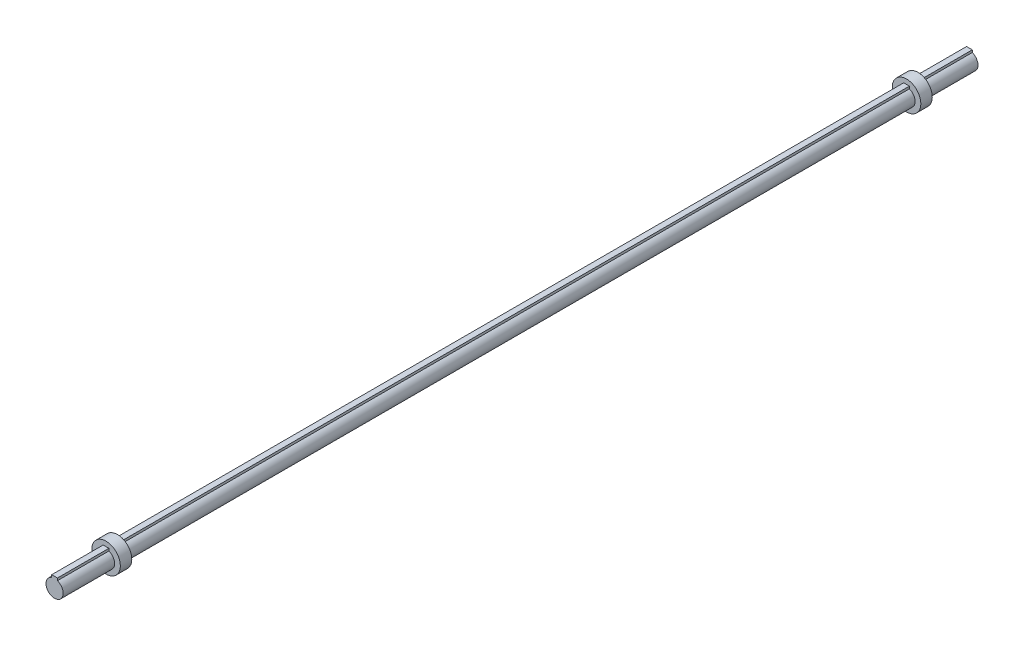
ISO-10303-21;
HEADER;
FILE_DESCRIPTION(('STEP AP214'),'2;1');
FILE_NAME('part.step','',(''),(''),'','','');
FILE_SCHEMA(('AUTOMOTIVE_DESIGN { 1 0 10303 214 1 1 1 1 }'));
ENDSEC;
DATA;
#1=APPLICATION_CONTEXT('core data for automotive mechanical design processes');
#2=APPLICATION_PROTOCOL_DEFINITION('international standard','automotive_design',2000,#1);
#3=PRODUCT_CONTEXT('',#1,'mechanical');
#4=PRODUCT('Part','Part','',(#3));
#5=PRODUCT_RELATED_PRODUCT_CATEGORY('part','',(#4));
#6=PRODUCT_DEFINITION_FORMATION('','',#4);
#7=PRODUCT_DEFINITION_CONTEXT('part definition',#1,'design');
#8=PRODUCT_DEFINITION('design','',#6,#7);
#9=PRODUCT_DEFINITION_SHAPE('','',#8);
#10=(LENGTH_UNIT() NAMED_UNIT(*) SI_UNIT(.MILLI.,.METRE.));
#11=(NAMED_UNIT(*) PLANE_ANGLE_UNIT() SI_UNIT($,.RADIAN.));
#12=(NAMED_UNIT(*) SI_UNIT($,.STERADIAN.) SOLID_ANGLE_UNIT());
#13=UNCERTAINTY_MEASURE_WITH_UNIT(LENGTH_MEASURE(1.E-05),#10,'distance_accuracy_value','');
#14=(GEOMETRIC_REPRESENTATION_CONTEXT(3) GLOBAL_UNCERTAINTY_ASSIGNED_CONTEXT((#13)) GLOBAL_UNIT_ASSIGNED_CONTEXT((#10,
#11,#12)) REPRESENTATION_CONTEXT('',''));
#15=CARTESIAN_POINT('',(0.,0.,0.));
#16=DIRECTION('',(0.,0.,1.));
#17=DIRECTION('',(1.,0.,0.));
#18=AXIS2_PLACEMENT_3D('',#15,#16,#17);
#19=CARTESIAN_POINT('',(0.,-1.65,800.));
#20=DIRECTION('',(0.,0.,-1.));
#21=DIRECTION('',(-1.,0.,0.));
#22=AXIS2_PLACEMENT_3D('',#19,#20,#21);
#23=CYLINDRICAL_SURFACE('',#22,15.);
#24=CARTESIAN_POINT('',(0.,-1.65,-690.));
#25=DIRECTION('',(0.,0.,-1.));
#26=DIRECTION('',(-1.,0.,0.));
#27=AXIS2_PLACEMENT_3D('',#24,#25,#26);
#28=CIRCLE('',#27,15.);
#29=CARTESIAN_POINT('',(5.,12.4921356237309,-690.));
#30=VERTEX_POINT('',#29);
#31=CARTESIAN_POINT('',(-5.,12.4921356237309,-690.));
#32=VERTEX_POINT('',#31);
#33=EDGE_CURVE('E47',#30,#32,#28,.T.);
#34=ORIENTED_EDGE('',*,*,#33,.F.);
#35=DIRECTION('',(0.,0.,-1.));
#36=VECTOR('',#35,1.);
#37=CARTESIAN_POINT('',(5.,12.4921356237309,800.));
#38=LINE('',#37,#36);
#39=CARTESIAN_POINT('',(5.,12.4921356237309,690.));
#40=VERTEX_POINT('',#39);
#41=EDGE_CURVE('E182',#40,#30,#38,.T.);
#42=ORIENTED_EDGE('',*,*,#41,.F.);
#43=CARTESIAN_POINT('',(0.,-1.65,690.));
#44=DIRECTION('',(0.,0.,1.));
#45=DIRECTION('',(1.,0.,0.));
#46=AXIS2_PLACEMENT_3D('',#43,#44,#45);
#47=CIRCLE('',#46,15.);
#48=CARTESIAN_POINT('',(-5.,12.4921356237309,690.));
#49=VERTEX_POINT('',#48);
#50=EDGE_CURVE('E200',#49,#40,#47,.T.);
#51=ORIENTED_EDGE('',*,*,#50,.F.);
#52=DIRECTION('',(0.,0.,-1.));
#53=VECTOR('',#52,1.);
#54=CARTESIAN_POINT('',(-5.,12.4921356237309,800.));
#55=LINE('',#54,#53);
#56=EDGE_CURVE('E147',#49,#32,#55,.T.);
#57=ORIENTED_EDGE('',*,*,#56,.T.);
#58=EDGE_LOOP('',(#34,#42,#51,#57));
#59=FACE_BOUND('',#58,.T.);
#60=ADVANCED_FACE('F32',(#59),#23,.T.);
#61=CARTESIAN_POINT('',(5.,16.65,800.));
#62=DIRECTION('',(-1.,0.,0.));
#63=DIRECTION('',(0.,0.,1.));
#64=AXIS2_PLACEMENT_3D('',#61,#62,#63);
#65=PLANE('',#64);
#66=DIRECTION('',(0.,-1.,0.));
#67=VECTOR('',#66,1.);
#68=CARTESIAN_POINT('',(5.,16.65,-690.));
#69=LINE('',#68,#67);
#70=CARTESIAN_POINT('',(5.,16.65,-690.));
#71=VERTEX_POINT('',#70);
#72=EDGE_CURVE('E54',#71,#30,#69,.T.);
#73=ORIENTED_EDGE('',*,*,#72,.F.);
#74=DIRECTION('',(0.,0.,-1.));
#75=VECTOR('',#74,1.);
#76=CARTESIAN_POINT('',(5.,16.65,800.));
#77=LINE('',#76,#75);
#78=CARTESIAN_POINT('',(5.,16.65,690.));
#79=VERTEX_POINT('',#78);
#80=EDGE_CURVE('E171',#79,#71,#77,.T.);
#81=ORIENTED_EDGE('',*,*,#80,.F.);
#82=DIRECTION('',(0.,1.,0.));
#83=VECTOR('',#82,1.);
#84=CARTESIAN_POINT('',(5.,16.65,690.));
#85=LINE('',#84,#83);
#86=EDGE_CURVE('E213',#40,#79,#85,.T.);
#87=ORIENTED_EDGE('',*,*,#86,.F.);
#88=ORIENTED_EDGE('',*,*,#41,.T.);
#89=EDGE_LOOP('',(#73,#81,#87,#88));
#90=FACE_BOUND('',#89,.T.);
#91=ADVANCED_FACE('F271',(#90),#65,.F.);
#92=CARTESIAN_POINT('',(-5.,16.65,800.));
#93=DIRECTION('',(0.,-1.,0.));
#94=DIRECTION('',(0.,0.,-1.));
#95=AXIS2_PLACEMENT_3D('',#92,#93,#94);
#96=PLANE('',#95);
#97=DIRECTION('',(1.,0.,0.));
#98=VECTOR('',#97,1.);
#99=CARTESIAN_POINT('',(-5.,16.65,-690.));
#100=LINE('',#99,#98);
#101=CARTESIAN_POINT('',(-5.,16.65,-690.));
#102=VERTEX_POINT('',#101);
#103=EDGE_CURVE('E140',#102,#71,#100,.T.);
#104=ORIENTED_EDGE('',*,*,#103,.F.);
#105=DIRECTION('',(0.,0.,-1.));
#106=VECTOR('',#105,1.);
#107=CARTESIAN_POINT('',(-5.,16.65,800.));
#108=LINE('',#107,#106);
#109=CARTESIAN_POINT('',(-5.,16.65,690.));
#110=VERTEX_POINT('',#109);
#111=EDGE_CURVE('E161',#110,#102,#108,.T.);
#112=ORIENTED_EDGE('',*,*,#111,.F.);
#113=DIRECTION('',(-1.,0.,0.));
#114=VECTOR('',#113,1.);
#115=CARTESIAN_POINT('',(-5.,16.65,690.));
#116=LINE('',#115,#114);
#117=EDGE_CURVE('E201',#79,#110,#116,.T.);
#118=ORIENTED_EDGE('',*,*,#117,.F.);
#119=ORIENTED_EDGE('',*,*,#80,.T.);
#120=EDGE_LOOP('',(#104,#112,#118,#119));
#121=FACE_BOUND('',#120,.T.);
#122=ADVANCED_FACE('F207',(#121),#96,.F.);
#123=CARTESIAN_POINT('',(-5.,12.4921356237309,800.));
#124=DIRECTION('',(1.,0.,0.));
#125=DIRECTION('',(0.,0.,-1.));
#126=AXIS2_PLACEMENT_3D('',#123,#124,#125);
#127=PLANE('',#126);
#128=DIRECTION('',(0.,1.,0.));
#129=VECTOR('',#128,1.);
#130=CARTESIAN_POINT('',(-5.,12.4921356237309,-690.));
#131=LINE('',#130,#129);
#132=EDGE_CURVE('E11',#32,#102,#131,.T.);
#133=ORIENTED_EDGE('',*,*,#132,.F.);
#134=ORIENTED_EDGE('',*,*,#56,.F.);
#135=DIRECTION('',(0.,-1.,0.));
#136=VECTOR('',#135,1.);
#137=CARTESIAN_POINT('',(-5.,12.4921356237309,690.));
#138=LINE('',#137,#136);
#139=EDGE_CURVE('E132',#110,#49,#138,.T.);
#140=ORIENTED_EDGE('',*,*,#139,.F.);
#141=ORIENTED_EDGE('',*,*,#111,.T.);
#142=EDGE_LOOP('',(#133,#134,#140,#141));
#143=FACE_BOUND('',#142,.T.);
#144=ADVANCED_FACE('F204',(#143),#127,.F.);
#145=CARTESIAN_POINT('',(0.,0.,690.));
#146=DIRECTION('',(0.,0.,1.));
#147=DIRECTION('',(1.,0.,0.));
#148=AXIS2_PLACEMENT_3D('',#145,#146,#147);
#149=PLANE('',#148);
#150=CARTESIAN_POINT('',(0.,0.,690.));
#151=DIRECTION('',(0.,0.,1.));
#152=DIRECTION('',(1.,0.,0.));
#153=AXIS2_PLACEMENT_3D('',#150,#151,#152);
#154=CIRCLE('',#153,25.);
#155=CARTESIAN_POINT('',(25.,0.,690.));
#156=VERTEX_POINT('',#155);
#157=EDGE_CURVE('E241',#156,#156,#154,.T.);
#158=ORIENTED_EDGE('',*,*,#157,.F.);
#159=EDGE_LOOP('',(#158));
#160=FACE_BOUND('',#159,.T.);
#161=ORIENTED_EDGE('',*,*,#139,.T.);
#162=ORIENTED_EDGE('',*,*,#50,.T.);
#163=ORIENTED_EDGE('',*,*,#86,.T.);
#164=ORIENTED_EDGE('',*,*,#117,.T.);
#165=EDGE_LOOP('',(#161,#162,#163,#164));
#166=FACE_BOUND('',#165,.T.);
#167=ADVANCED_FACE('F197',(#160,#166),#149,.F.);
#168=CARTESIAN_POINT('',(0.,0.,710.));
#169=DIRECTION('',(0.,0.,1.));
#170=DIRECTION('',(1.,0.,0.));
#171=AXIS2_PLACEMENT_3D('',#168,#169,#170);
#172=PLANE('',#171);
#173=CARTESIAN_POINT('',(0.,0.,710.));
#174=DIRECTION('',(0.,0.,1.));
#175=DIRECTION('',(1.,0.,0.));
#176=AXIS2_PLACEMENT_3D('',#173,#174,#175);
#177=CIRCLE('',#176,25.);
#178=CARTESIAN_POINT('',(25.,0.,710.));
#179=VERTEX_POINT('',#178);
#180=EDGE_CURVE('E240',#179,#179,#177,.T.);
#181=ORIENTED_EDGE('',*,*,#180,.T.);
#182=EDGE_LOOP('',(#181));
#183=FACE_BOUND('',#182,.T.);
#184=CARTESIAN_POINT('',(0.,-1.65,710.));
#185=DIRECTION('',(0.,0.,1.));
#186=DIRECTION('',(1.,0.,0.));
#187=AXIS2_PLACEMENT_3D('',#184,#185,#186);
#188=CIRCLE('',#187,15.);
#189=CARTESIAN_POINT('',(-5.,12.4921356237309,710.));
#190=VERTEX_POINT('',#189);
#191=CARTESIAN_POINT('',(5.,12.4921356237309,710.));
#192=VERTEX_POINT('',#191);
#193=EDGE_CURVE('E250',#190,#192,#188,.T.);
#194=ORIENTED_EDGE('',*,*,#193,.F.);
#195=DIRECTION('',(0.,-1.,0.));
#196=VECTOR('',#195,1.);
#197=CARTESIAN_POINT('',(-5.,12.4921356237309,710.));
#198=LINE('',#197,#196);
#199=CARTESIAN_POINT('',(-5.,16.65,710.));
#200=VERTEX_POINT('',#199);
#201=EDGE_CURVE('E188',#200,#190,#198,.T.);
#202=ORIENTED_EDGE('',*,*,#201,.F.);
#203=DIRECTION('',(-1.,0.,0.));
#204=VECTOR('',#203,1.);
#205=CARTESIAN_POINT('',(-5.,16.65,710.));
#206=LINE('',#205,#204);
#207=CARTESIAN_POINT('',(5.,16.65,710.));
#208=VERTEX_POINT('',#207);
#209=EDGE_CURVE('E244',#208,#200,#206,.T.);
#210=ORIENTED_EDGE('',*,*,#209,.F.);
#211=DIRECTION('',(0.,1.,0.));
#212=VECTOR('',#211,1.);
#213=CARTESIAN_POINT('',(5.,16.65,710.));
#214=LINE('',#213,#212);
#215=EDGE_CURVE('E248',#192,#208,#214,.T.);
#216=ORIENTED_EDGE('',*,*,#215,.F.);
#217=EDGE_LOOP('',(#194,#202,#210,#216));
#218=FACE_BOUND('',#217,.T.);
#219=ADVANCED_FACE('F252',(#183,#218),#172,.T.);
#220=CARTESIAN_POINT('',(0.,0.,690.));
#221=DIRECTION('',(0.,0.,1.));
#222=DIRECTION('',(1.,0.,0.));
#223=AXIS2_PLACEMENT_3D('',#220,#221,#222);
#224=CYLINDRICAL_SURFACE('',#223,25.);
#225=ORIENTED_EDGE('',*,*,#157,.T.);
#226=EDGE_LOOP('',(#225));
#227=FACE_BOUND('',#226,.T.);
#228=ORIENTED_EDGE('',*,*,#180,.F.);
#229=EDGE_LOOP('',(#228));
#230=FACE_BOUND('',#229,.T.);
#231=ADVANCED_FACE('F265',(#227,#230),#224,.T.);
#232=CARTESIAN_POINT('',(0.,-1.65,800.));
#233=DIRECTION('',(0.,0.,1.));
#234=DIRECTION('',(1.,0.,0.));
#235=AXIS2_PLACEMENT_3D('',#232,#233,#234);
#236=PLANE('',#235);
#237=CARTESIAN_POINT('',(0.,-1.65,800.));
#238=DIRECTION('',(0.,0.,1.));
#239=DIRECTION('',(1.,0.,0.));
#240=AXIS2_PLACEMENT_3D('',#237,#238,#239);
#241=CIRCLE('',#240,15.);
#242=CARTESIAN_POINT('',(-5.,12.4921356237309,800.));
#243=VERTEX_POINT('',#242);
#244=CARTESIAN_POINT('',(5.,12.4921356237309,800.));
#245=VERTEX_POINT('',#244);
#246=EDGE_CURVE('E220',#243,#245,#241,.T.);
#247=ORIENTED_EDGE('',*,*,#246,.T.);
#248=DIRECTION('',(0.,1.,0.));
#249=VECTOR('',#248,1.);
#250=CARTESIAN_POINT('',(5.,16.65,800.));
#251=LINE('',#250,#249);
#252=CARTESIAN_POINT('',(5.,16.65,800.));
#253=VERTEX_POINT('',#252);
#254=EDGE_CURVE('E223',#245,#253,#251,.T.);
#255=ORIENTED_EDGE('',*,*,#254,.T.);
#256=DIRECTION('',(-1.,0.,0.));
#257=VECTOR('',#256,1.);
#258=CARTESIAN_POINT('',(-5.,16.65,800.));
#259=LINE('',#258,#257);
#260=CARTESIAN_POINT('',(-5.,16.65,800.));
#261=VERTEX_POINT('',#260);
#262=EDGE_CURVE('E151',#253,#261,#259,.T.);
#263=ORIENTED_EDGE('',*,*,#262,.T.);
#264=DIRECTION('',(0.,-1.,0.));
#265=VECTOR('',#264,1.);
#266=CARTESIAN_POINT('',(-5.,12.4921356237309,800.));
#267=LINE('',#266,#265);
#268=EDGE_CURVE('E148',#261,#243,#267,.T.);
#269=ORIENTED_EDGE('',*,*,#268,.T.);
#270=EDGE_LOOP('',(#247,#255,#263,#269));
#271=FACE_BOUND('',#270,.T.);
#272=ADVANCED_FACE('F256',(#271),#236,.T.);
#273=EDGE_CURVE('E162',#261,#200,#108,.T.);
#274=ORIENTED_EDGE('',*,*,#273,.T.);
#275=ORIENTED_EDGE('',*,*,#201,.T.);
#276=EDGE_CURVE('E150',#243,#190,#55,.T.);
#277=ORIENTED_EDGE('',*,*,#276,.F.);
#278=ORIENTED_EDGE('',*,*,#268,.F.);
#279=EDGE_LOOP('',(#274,#275,#277,#278));
#280=FACE_BOUND('',#279,.T.);
#281=ADVANCED_FACE('F257',(#280),#127,.F.);
#282=EDGE_CURVE('E172',#253,#208,#77,.T.);
#283=ORIENTED_EDGE('',*,*,#282,.T.);
#284=ORIENTED_EDGE('',*,*,#209,.T.);
#285=ORIENTED_EDGE('',*,*,#273,.F.);
#286=ORIENTED_EDGE('',*,*,#262,.F.);
#287=EDGE_LOOP('',(#283,#284,#285,#286));
#288=FACE_BOUND('',#287,.T.);
#289=ADVANCED_FACE('F254',(#288),#96,.F.);
#290=EDGE_CURVE('E183',#245,#192,#38,.T.);
#291=ORIENTED_EDGE('',*,*,#290,.T.);
#292=ORIENTED_EDGE('',*,*,#215,.T.);
#293=ORIENTED_EDGE('',*,*,#282,.F.);
#294=ORIENTED_EDGE('',*,*,#254,.F.);
#295=EDGE_LOOP('',(#291,#292,#293,#294));
#296=FACE_BOUND('',#295,.T.);
#297=ADVANCED_FACE('F253',(#296),#65,.F.);
#298=ORIENTED_EDGE('',*,*,#276,.T.);
#299=ORIENTED_EDGE('',*,*,#193,.T.);
#300=ORIENTED_EDGE('',*,*,#290,.F.);
#301=ORIENTED_EDGE('',*,*,#246,.F.);
#302=EDGE_LOOP('',(#298,#299,#300,#301));
#303=FACE_BOUND('',#302,.T.);
#304=ADVANCED_FACE('F34',(#303),#23,.T.);
#305=CARTESIAN_POINT('',(0.,0.,-690.));
#306=DIRECTION('',(0.,0.,-1.));
#307=DIRECTION('',(1.,0.,0.));
#308=AXIS2_PLACEMENT_3D('',#305,#306,#307);
#309=PLANE('',#308);
#310=CARTESIAN_POINT('',(0.,0.,-690.));
#311=DIRECTION('',(0.,0.,1.));
#312=DIRECTION('',(1.,0.,0.));
#313=AXIS2_PLACEMENT_3D('',#310,#311,#312);
#314=CIRCLE('',#313,25.);
#315=CARTESIAN_POINT('',(25.,0.,-690.));
#316=VERTEX_POINT('',#315);
#317=EDGE_CURVE('E234',#316,#316,#314,.T.);
#318=ORIENTED_EDGE('',*,*,#317,.T.);
#319=EDGE_LOOP('',(#318));
#320=FACE_BOUND('',#319,.T.);
#321=ORIENTED_EDGE('',*,*,#72,.T.);
#322=ORIENTED_EDGE('',*,*,#33,.T.);
#323=ORIENTED_EDGE('',*,*,#132,.T.);
#324=ORIENTED_EDGE('',*,*,#103,.T.);
#325=EDGE_LOOP('',(#321,#322,#323,#324));
#326=FACE_BOUND('',#325,.T.);
#327=ADVANCED_FACE('F211',(#320,#326),#309,.F.);
#328=CARTESIAN_POINT('',(0.,0.,-710.));
#329=DIRECTION('',(0.,0.,-1.));
#330=DIRECTION('',(1.,0.,0.));
#331=AXIS2_PLACEMENT_3D('',#328,#329,#330);
#332=PLANE('',#331);
#333=CARTESIAN_POINT('',(0.,0.,-710.));
#334=DIRECTION('',(0.,0.,1.));
#335=DIRECTION('',(1.,0.,0.));
#336=AXIS2_PLACEMENT_3D('',#333,#334,#335);
#337=CIRCLE('',#336,25.);
#338=CARTESIAN_POINT('',(25.,0.,-710.));
#339=VERTEX_POINT('',#338);
#340=EDGE_CURVE('E403',#339,#339,#337,.T.);
#341=ORIENTED_EDGE('',*,*,#340,.F.);
#342=EDGE_LOOP('',(#341));
#343=FACE_BOUND('',#342,.T.);
#344=CARTESIAN_POINT('',(0.,-1.65,-710.));
#345=DIRECTION('',(0.,0.,-1.));
#346=DIRECTION('',(-1.,0.,0.));
#347=AXIS2_PLACEMENT_3D('',#344,#345,#346);
#348=CIRCLE('',#347,15.);
#349=CARTESIAN_POINT('',(5.,12.4921356237309,-710.));
#350=VERTEX_POINT('',#349);
#351=CARTESIAN_POINT('',(-5.,12.4921356237309,-710.));
#352=VERTEX_POINT('',#351);
#353=EDGE_CURVE('E125',#350,#352,#348,.T.);
#354=ORIENTED_EDGE('',*,*,#353,.F.);
#355=DIRECTION('',(0.,-1.,0.));
#356=VECTOR('',#355,1.);
#357=CARTESIAN_POINT('',(5.,16.65,-710.));
#358=LINE('',#357,#356);
#359=CARTESIAN_POINT('',(5.,16.65,-710.));
#360=VERTEX_POINT('',#359);
#361=EDGE_CURVE('E141',#360,#350,#358,.T.);
#362=ORIENTED_EDGE('',*,*,#361,.F.);
#363=DIRECTION('',(1.,0.,0.));
#364=VECTOR('',#363,1.);
#365=CARTESIAN_POINT('',(-5.,16.65,-710.));
#366=LINE('',#365,#364);
#367=CARTESIAN_POINT('',(-5.,16.65,-710.));
#368=VERTEX_POINT('',#367);
#369=EDGE_CURVE('E128',#368,#360,#366,.T.);
#370=ORIENTED_EDGE('',*,*,#369,.F.);
#371=DIRECTION('',(0.,1.,0.));
#372=VECTOR('',#371,1.);
#373=CARTESIAN_POINT('',(-5.,12.4921356237309,-710.));
#374=LINE('',#373,#372);
#375=EDGE_CURVE('E40',#352,#368,#374,.T.);
#376=ORIENTED_EDGE('',*,*,#375,.F.);
#377=EDGE_LOOP('',(#354,#362,#370,#376));
#378=FACE_BOUND('',#377,.T.);
#379=ADVANCED_FACE('F124',(#343,#378),#332,.T.);
#380=CARTESIAN_POINT('',(0.,0.,-690.));
#381=DIRECTION('',(0.,0.,-1.));
#382=DIRECTION('',(-1.,0.,0.));
#383=AXIS2_PLACEMENT_3D('',#380,#381,#382);
#384=CYLINDRICAL_SURFACE('',#383,25.);
#385=ORIENTED_EDGE('',*,*,#317,.F.);
#386=EDGE_LOOP('',(#385));
#387=FACE_BOUND('',#386,.T.);
#388=ORIENTED_EDGE('',*,*,#340,.T.);
#389=EDGE_LOOP('',(#388));
#390=FACE_BOUND('',#389,.T.);
#391=ADVANCED_FACE('F335',(#387,#390),#384,.T.);
#392=CARTESIAN_POINT('',(0.,-1.65,-800.));
#393=DIRECTION('',(0.,0.,1.));
#394=DIRECTION('',(1.,0.,0.));
#395=AXIS2_PLACEMENT_3D('',#392,#393,#394);
#396=PLANE('',#395);
#397=CARTESIAN_POINT('',(0.,-1.65,-800.));
#398=DIRECTION('',(0.,0.,1.));
#399=DIRECTION('',(1.,0.,0.));
#400=AXIS2_PLACEMENT_3D('',#397,#398,#399);
#401=CIRCLE('',#400,15.);
#402=CARTESIAN_POINT('',(-5.,12.4921356237309,-800.));
#403=VERTEX_POINT('',#402);
#404=CARTESIAN_POINT('',(5.,12.4921356237309,-800.));
#405=VERTEX_POINT('',#404);
#406=EDGE_CURVE('E212',#403,#405,#401,.T.);
#407=ORIENTED_EDGE('',*,*,#406,.F.);
#408=DIRECTION('',(0.,-1.,0.));
#409=VECTOR('',#408,1.);
#410=CARTESIAN_POINT('',(-5.,12.4921356237309,-800.));
#411=LINE('',#410,#409);
#412=CARTESIAN_POINT('',(-5.,16.65,-800.));
#413=VERTEX_POINT('',#412);
#414=EDGE_CURVE('E145',#413,#403,#411,.T.);
#415=ORIENTED_EDGE('',*,*,#414,.F.);
#416=DIRECTION('',(-1.,0.,0.));
#417=VECTOR('',#416,1.);
#418=CARTESIAN_POINT('',(-5.,16.65,-800.));
#419=LINE('',#418,#417);
#420=CARTESIAN_POINT('',(5.,16.65,-800.));
#421=VERTEX_POINT('',#420);
#422=EDGE_CURVE('E227',#421,#413,#419,.T.);
#423=ORIENTED_EDGE('',*,*,#422,.F.);
#424=DIRECTION('',(0.,1.,0.));
#425=VECTOR('',#424,1.);
#426=CARTESIAN_POINT('',(5.,16.65,-800.));
#427=LINE('',#426,#425);
#428=EDGE_CURVE('E215',#405,#421,#427,.T.);
#429=ORIENTED_EDGE('',*,*,#428,.F.);
#430=EDGE_LOOP('',(#407,#415,#423,#429));
#431=FACE_BOUND('',#430,.T.);
#432=ADVANCED_FACE('F231',(#431),#396,.F.);
#433=EDGE_CURVE('E137',#352,#403,#55,.T.);
#434=ORIENTED_EDGE('',*,*,#433,.F.);
#435=ORIENTED_EDGE('',*,*,#375,.T.);
#436=EDGE_CURVE('E156',#368,#413,#108,.T.);
#437=ORIENTED_EDGE('',*,*,#436,.T.);
#438=ORIENTED_EDGE('',*,*,#414,.T.);
#439=EDGE_LOOP('',(#434,#435,#437,#438));
#440=FACE_BOUND('',#439,.T.);
#441=ADVANCED_FACE('F143',(#440),#127,.F.);
#442=ORIENTED_EDGE('',*,*,#436,.F.);
#443=ORIENTED_EDGE('',*,*,#369,.T.);
#444=EDGE_CURVE('E166',#360,#421,#77,.T.);
#445=ORIENTED_EDGE('',*,*,#444,.T.);
#446=ORIENTED_EDGE('',*,*,#422,.T.);
#447=EDGE_LOOP('',(#442,#443,#445,#446));
#448=FACE_BOUND('',#447,.T.);
#449=ADVANCED_FACE('F229',(#448),#96,.F.);
#450=ORIENTED_EDGE('',*,*,#444,.F.);
#451=ORIENTED_EDGE('',*,*,#361,.T.);
#452=EDGE_CURVE('E139',#350,#405,#38,.T.);
#453=ORIENTED_EDGE('',*,*,#452,.T.);
#454=ORIENTED_EDGE('',*,*,#428,.T.);
#455=EDGE_LOOP('',(#450,#451,#453,#454));
#456=FACE_BOUND('',#455,.T.);
#457=ADVANCED_FACE('F232',(#456),#65,.F.);
#458=ORIENTED_EDGE('',*,*,#452,.F.);
#459=ORIENTED_EDGE('',*,*,#353,.T.);
#460=ORIENTED_EDGE('',*,*,#433,.T.);
#461=ORIENTED_EDGE('',*,*,#406,.T.);
#462=EDGE_LOOP('',(#458,#459,#460,#461));
#463=FACE_BOUND('',#462,.T.);
#464=ADVANCED_FACE('F135',(#463),#23,.T.);
#465=CLOSED_SHELL('',(#60,#91,#122,#144,#167,#219,#231,#272,#281,#289,#297,#304,#327,#379,#391,
#432,#441,#449,#457,#464));
#466=MANIFOLD_SOLID_BREP('B2',#465);
#467=ADVANCED_BREP_SHAPE_REPRESENTATION('',(#18,#466),#14);
#468=SHAPE_DEFINITION_REPRESENTATION(#9,#467);
ENDSEC;
END-ISO-10303-21;
